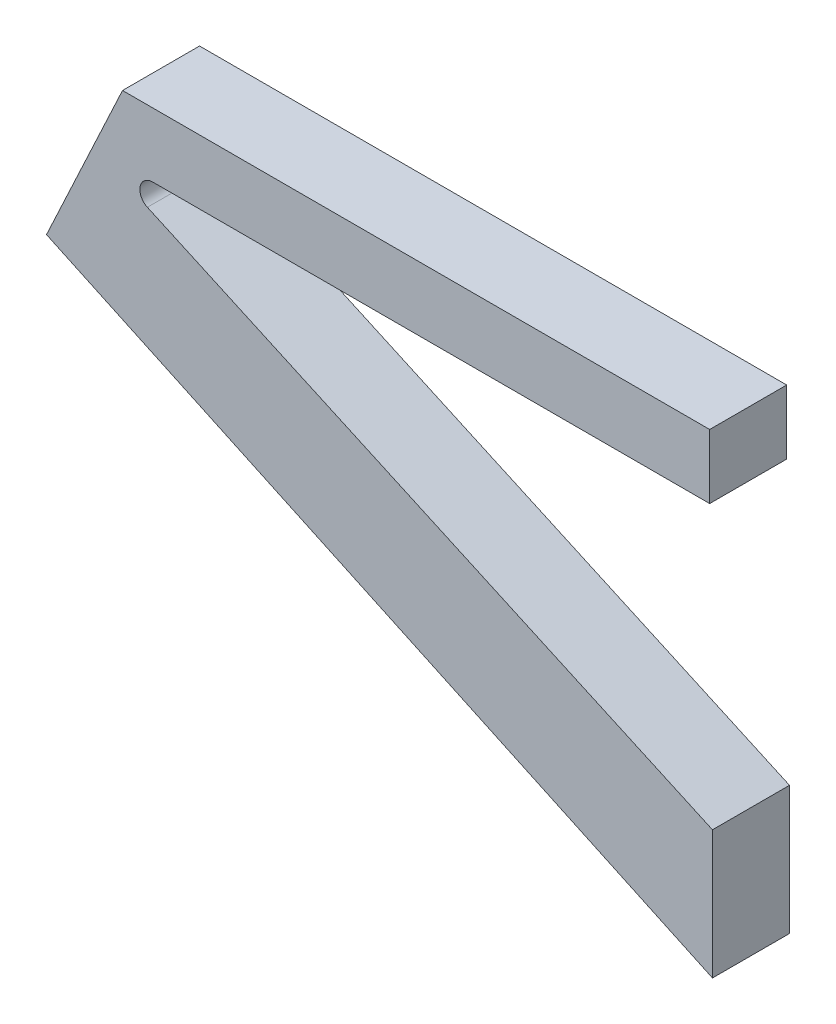
ISO-10303-21;
HEADER;
FILE_DESCRIPTION(('STEP AP214'),'2;1');
FILE_NAME('part.step','',(''),(''),'','','');
FILE_SCHEMA(('AUTOMOTIVE_DESIGN { 1 0 10303 214 1 1 1 1 }'));
ENDSEC;
DATA;
#1=APPLICATION_CONTEXT('core data for automotive mechanical design processes');
#2=APPLICATION_PROTOCOL_DEFINITION('international standard','automotive_design',2000,#1);
#3=PRODUCT_CONTEXT('',#1,'mechanical');
#4=PRODUCT('Part','Part','',(#3));
#5=PRODUCT_RELATED_PRODUCT_CATEGORY('part','',(#4));
#6=PRODUCT_DEFINITION_FORMATION('','',#4);
#7=PRODUCT_DEFINITION_CONTEXT('part definition',#1,'design');
#8=PRODUCT_DEFINITION('design','',#6,#7);
#9=PRODUCT_DEFINITION_SHAPE('','',#8);
#10=(LENGTH_UNIT() NAMED_UNIT(*) SI_UNIT(.MILLI.,.METRE.));
#11=(NAMED_UNIT(*) PLANE_ANGLE_UNIT() SI_UNIT($,.RADIAN.));
#12=(NAMED_UNIT(*) SI_UNIT($,.STERADIAN.) SOLID_ANGLE_UNIT());
#13=UNCERTAINTY_MEASURE_WITH_UNIT(LENGTH_MEASURE(1.E-05),#10,'distance_accuracy_value','');
#14=(GEOMETRIC_REPRESENTATION_CONTEXT(3) GLOBAL_UNCERTAINTY_ASSIGNED_CONTEXT((#13)) GLOBAL_UNIT_ASSIGNED_CONTEXT((#10,
#11,#12)) REPRESENTATION_CONTEXT('',''));
#15=CARTESIAN_POINT('',(0.,0.,0.));
#16=DIRECTION('',(0.,0.,1.));
#17=DIRECTION('',(1.,0.,0.));
#18=AXIS2_PLACEMENT_3D('',#15,#16,#17);
#19=CARTESIAN_POINT('',(0.,0.,-3.));
#20=DIRECTION('',(-1.,0.,0.));
#21=DIRECTION('',(0.,0.,1.));
#22=AXIS2_PLACEMENT_3D('',#19,#20,#21);
#23=PLANE('',#22);
#24=DIRECTION('',(0.,0.,1.));
#25=VECTOR('',#24,1.);
#26=CARTESIAN_POINT('',(0.,0.,-3.));
#27=LINE('',#26,#25);
#28=CARTESIAN_POINT('',(0.,0.,-3.));
#29=VERTEX_POINT('',#28);
#30=CARTESIAN_POINT('',(0.,0.,3.));
#31=VERTEX_POINT('',#30);
#32=EDGE_CURVE('E122',#29,#31,#27,.T.);
#33=ORIENTED_EDGE('',*,*,#32,.T.);
#34=DIRECTION('',(0.,-1.,0.));
#35=VECTOR('',#34,1.);
#36=CARTESIAN_POINT('',(0.,0.,3.));
#37=LINE('',#36,#35);
#38=CARTESIAN_POINT('',(0.,-5.,3.));
#39=VERTEX_POINT('',#38);
#40=EDGE_CURVE('E119',#31,#39,#37,.T.);
#41=ORIENTED_EDGE('',*,*,#40,.T.);
#42=DIRECTION('',(0.,0.,1.));
#43=VECTOR('',#42,1.);
#44=CARTESIAN_POINT('',(0.,-5.,-3.));
#45=LINE('',#44,#43);
#46=CARTESIAN_POINT('',(0.,-5.,-3.));
#47=VERTEX_POINT('',#46);
#48=EDGE_CURVE('E105',#47,#39,#45,.T.);
#49=ORIENTED_EDGE('',*,*,#48,.F.);
#50=DIRECTION('',(0.,-1.,0.));
#51=VECTOR('',#50,1.);
#52=CARTESIAN_POINT('',(0.,0.,-3.));
#53=LINE('',#52,#51);
#54=EDGE_CURVE('E138',#29,#47,#53,.T.);
#55=ORIENTED_EDGE('',*,*,#54,.F.);
#56=EDGE_LOOP('',(#33,#41,#49,#55));
#57=FACE_BOUND('',#56,.T.);
#58=ADVANCED_FACE('F43',(#57),#23,.F.);
#59=CARTESIAN_POINT('',(0.,-5.,-3.));
#60=DIRECTION('',(0.,1.,0.));
#61=DIRECTION('',(-1.,0.,0.));
#62=AXIS2_PLACEMENT_3D('',#59,#60,#61);
#63=PLANE('',#62);
#64=DIRECTION('',(-1.,0.,0.));
#65=VECTOR('',#64,1.);
#66=CARTESIAN_POINT('',(0.,-5.,3.));
#67=LINE('',#66,#65);
#68=CARTESIAN_POINT('',(-43.3887218637579,-5.,3.));
#69=VERTEX_POINT('',#68);
#70=EDGE_CURVE('E107',#39,#69,#67,.T.);
#71=ORIENTED_EDGE('',*,*,#70,.T.);
#72=DIRECTION('',(0.,0.,1.));
#73=VECTOR('',#72,1.);
#74=CARTESIAN_POINT('',(-43.3887218637579,-5.,-3.));
#75=LINE('',#74,#73);
#76=CARTESIAN_POINT('',(-43.3887218637579,-5.,-3.));
#77=VERTEX_POINT('',#76);
#78=EDGE_CURVE('E58',#69,#77,#75,.F.);
#79=ORIENTED_EDGE('',*,*,#78,.T.);
#80=DIRECTION('',(-1.,0.,0.));
#81=VECTOR('',#80,1.);
#82=CARTESIAN_POINT('',(0.,-5.,-3.));
#83=LINE('',#82,#81);
#84=EDGE_CURVE('E108',#47,#77,#83,.T.);
#85=ORIENTED_EDGE('',*,*,#84,.F.);
#86=ORIENTED_EDGE('',*,*,#48,.T.);
#87=EDGE_LOOP('',(#71,#79,#85,#86));
#88=FACE_BOUND('',#87,.T.);
#89=ADVANCED_FACE('F106',(#88),#63,.F.);
#90=CARTESIAN_POINT('',(-48.01,-5.,-3.));
#91=DIRECTION('',(-0.413422293216823,-0.910539404677987,0.));
#92=DIRECTION('',(0.910539404677987,-0.413422293216823,0.));
#93=AXIS2_PLACEMENT_3D('',#90,#91,#92);
#94=PLANE('',#93);
#95=DIRECTION('',(0.910539404677987,-0.413422293216823,0.));
#96=VECTOR('',#95,1.);
#97=CARTESIAN_POINT('',(-48.01,-5.,-3.));
#98=LINE('',#97,#96);
#99=CARTESIAN_POINT('',(-43.8021441569747,-6.91053940467799,-3.));
#100=VERTEX_POINT('',#99);
#101=CARTESIAN_POINT('',(0.217510674102606,-26.8972709545476,-3.));
#102=VERTEX_POINT('',#101);
#103=EDGE_CURVE('E141',#100,#102,#98,.T.);
#104=ORIENTED_EDGE('',*,*,#103,.F.);
#105=DIRECTION('',(0.,0.,1.));
#106=VECTOR('',#105,1.);
#107=CARTESIAN_POINT('',(-43.8021441569747,-6.91053940467799,3.));
#108=LINE('',#107,#106);
#109=CARTESIAN_POINT('',(-43.8021441569747,-6.91053940467799,3.));
#110=VERTEX_POINT('',#109);
#111=EDGE_CURVE('E113',#100,#110,#108,.T.);
#112=ORIENTED_EDGE('',*,*,#111,.T.);
#113=DIRECTION('',(0.910539404677987,-0.413422293216823,0.));
#114=VECTOR('',#113,1.);
#115=CARTESIAN_POINT('',(-48.01,-5.,3.));
#116=LINE('',#115,#114);
#117=CARTESIAN_POINT('',(0.217510674102606,-26.8972709545476,3.));
#118=VERTEX_POINT('',#117);
#119=EDGE_CURVE('E120',#110,#118,#116,.T.);
#120=ORIENTED_EDGE('',*,*,#119,.T.);
#121=DIRECTION('',(0.,0.,1.));
#122=VECTOR('',#121,1.);
#123=CARTESIAN_POINT('',(0.217510674102606,-26.8972709545476,-3.));
#124=LINE('',#123,#122);
#125=EDGE_CURVE('E114',#102,#118,#124,.T.);
#126=ORIENTED_EDGE('',*,*,#125,.F.);
#127=EDGE_LOOP('',(#104,#112,#120,#126));
#128=FACE_BOUND('',#127,.T.);
#129=ADVANCED_FACE('F169',(#128),#94,.F.);
#130=CARTESIAN_POINT('',(0.217510674102606,-36.8972709545476,-3.));
#131=DIRECTION('',(1.,0.,0.));
#132=DIRECTION('',(0.,0.,-1.));
#133=AXIS2_PLACEMENT_3D('',#130,#131,#132);
#134=PLANE('',#133);
#135=ORIENTED_EDGE('',*,*,#125,.T.);
#136=DIRECTION('',(0.,1.,0.));
#137=VECTOR('',#136,1.);
#138=CARTESIAN_POINT('',(0.217510674102606,-36.8972709545476,3.));
#139=LINE('',#138,#137);
#140=CARTESIAN_POINT('',(0.217510674102606,-36.8972709545476,3.));
#141=VERTEX_POINT('',#140);
#142=EDGE_CURVE('E127',#141,#118,#139,.T.);
#143=ORIENTED_EDGE('',*,*,#142,.F.);
#144=DIRECTION('',(0.,0.,1.));
#145=VECTOR('',#144,1.);
#146=CARTESIAN_POINT('',(0.217510674102606,-36.8972709545476,-3.));
#147=LINE('',#146,#145);
#148=CARTESIAN_POINT('',(0.217510674102606,-36.8972709545476,-3.));
#149=VERTEX_POINT('',#148);
#150=EDGE_CURVE('E160',#149,#141,#147,.T.);
#151=ORIENTED_EDGE('',*,*,#150,.F.);
#152=DIRECTION('',(0.,1.,0.));
#153=VECTOR('',#152,1.);
#154=CARTESIAN_POINT('',(0.217510674102606,-36.8972709545476,-3.));
#155=LINE('',#154,#153);
#156=EDGE_CURVE('E143',#149,#102,#155,.T.);
#157=ORIENTED_EDGE('',*,*,#156,.T.);
#158=EDGE_LOOP('',(#135,#143,#151,#157));
#159=FACE_BOUND('',#158,.T.);
#160=ADVANCED_FACE('F176',(#159),#134,.T.);
#161=CARTESIAN_POINT('',(-51.6610843591942,-12.6862429430981,-3.));
#162=DIRECTION('',(-0.422900052601738,-0.906176332459333,0.));
#163=DIRECTION('',(0.906176332459333,-0.422900052601738,0.));
#164=AXIS2_PLACEMENT_3D('',#161,#162,#163);
#165=PLANE('',#164);
#166=ORIENTED_EDGE('',*,*,#150,.T.);
#167=DIRECTION('',(0.906176332459333,-0.422900052601738,0.));
#168=VECTOR('',#167,1.);
#169=CARTESIAN_POINT('',(-51.6610843591942,-12.6862429430981,3.));
#170=LINE('',#169,#168);
#171=CARTESIAN_POINT('',(-51.6610843591942,-12.6862429430981,3.));
#172=VERTEX_POINT('',#171);
#173=EDGE_CURVE('E130',#172,#141,#170,.T.);
#174=ORIENTED_EDGE('',*,*,#173,.F.);
#175=DIRECTION('',(0.,0.,1.));
#176=VECTOR('',#175,1.);
#177=CARTESIAN_POINT('',(-51.6610843591942,-12.6862429430981,-3.));
#178=LINE('',#177,#176);
#179=CARTESIAN_POINT('',(-51.6610843591942,-12.6862429430981,-3.));
#180=VERTEX_POINT('',#179);
#181=EDGE_CURVE('E158',#180,#172,#178,.T.);
#182=ORIENTED_EDGE('',*,*,#181,.F.);
#183=DIRECTION('',(0.906176332459333,-0.422900052601738,0.));
#184=VECTOR('',#183,1.);
#185=CARTESIAN_POINT('',(-51.6610843591942,-12.6862429430981,-3.));
#186=LINE('',#185,#184);
#187=EDGE_CURVE('E146',#180,#149,#186,.T.);
#188=ORIENTED_EDGE('',*,*,#187,.T.);
#189=EDGE_LOOP('',(#166,#174,#182,#188));
#190=FACE_BOUND('',#189,.T.);
#191=ADVANCED_FACE('F183',(#190),#165,.T.);
#192=CARTESIAN_POINT('',(-45.74,0.,-3.));
#193=DIRECTION('',(-0.906160210221291,0.422934597085301,0.));
#194=DIRECTION('',(-0.422934597085301,-0.906160210221291,0.));
#195=AXIS2_PLACEMENT_3D('',#192,#193,#194);
#196=PLANE('',#195);
#197=ORIENTED_EDGE('',*,*,#181,.T.);
#198=DIRECTION('',(-0.422934597085301,-0.906160210221291,0.));
#199=VECTOR('',#198,1.);
#200=CARTESIAN_POINT('',(-45.74,0.,3.));
#201=LINE('',#200,#199);
#202=CARTESIAN_POINT('',(-45.74,0.,3.));
#203=VERTEX_POINT('',#202);
#204=EDGE_CURVE('E133',#203,#172,#201,.T.);
#205=ORIENTED_EDGE('',*,*,#204,.F.);
#206=DIRECTION('',(0.,0.,1.));
#207=VECTOR('',#206,1.);
#208=CARTESIAN_POINT('',(-45.74,0.,-3.));
#209=LINE('',#208,#207);
#210=CARTESIAN_POINT('',(-45.74,0.,-3.));
#211=VERTEX_POINT('',#210);
#212=EDGE_CURVE('E156',#211,#203,#209,.T.);
#213=ORIENTED_EDGE('',*,*,#212,.F.);
#214=DIRECTION('',(-0.422934597085301,-0.906160210221291,0.));
#215=VECTOR('',#214,1.);
#216=CARTESIAN_POINT('',(-45.74,0.,-3.));
#217=LINE('',#216,#215);
#218=EDGE_CURVE('E149',#211,#180,#217,.T.);
#219=ORIENTED_EDGE('',*,*,#218,.T.);
#220=EDGE_LOOP('',(#197,#205,#213,#219));
#221=FACE_BOUND('',#220,.T.);
#222=ADVANCED_FACE('F186',(#221),#196,.T.);
#223=CARTESIAN_POINT('',(0.,0.,-3.));
#224=DIRECTION('',(0.,1.,0.));
#225=DIRECTION('',(-1.,0.,0.));
#226=AXIS2_PLACEMENT_3D('',#223,#224,#225);
#227=PLANE('',#226);
#228=ORIENTED_EDGE('',*,*,#212,.T.);
#229=DIRECTION('',(-1.,0.,0.));
#230=VECTOR('',#229,1.);
#231=CARTESIAN_POINT('',(0.,0.,3.));
#232=LINE('',#231,#230);
#233=EDGE_CURVE('E136',#31,#203,#232,.T.);
#234=ORIENTED_EDGE('',*,*,#233,.F.);
#235=ORIENTED_EDGE('',*,*,#32,.F.);
#236=DIRECTION('',(-1.,0.,0.));
#237=VECTOR('',#236,1.);
#238=CARTESIAN_POINT('',(0.,0.,-3.));
#239=LINE('',#238,#237);
#240=EDGE_CURVE('E152',#29,#211,#239,.T.);
#241=ORIENTED_EDGE('',*,*,#240,.T.);
#242=EDGE_LOOP('',(#228,#234,#235,#241));
#243=FACE_BOUND('',#242,.T.);
#244=ADVANCED_FACE('F188',(#243),#227,.T.);
#245=CARTESIAN_POINT('',(0.,0.,-3.));
#246=DIRECTION('',(0.,0.,-1.));
#247=DIRECTION('',(-1.,0.,0.));
#248=AXIS2_PLACEMENT_3D('',#245,#246,#247);
#249=PLANE('',#248);
#250=ORIENTED_EDGE('',*,*,#54,.T.);
#251=ORIENTED_EDGE('',*,*,#84,.T.);
#252=CARTESIAN_POINT('',(-43.3887218637579,-6.,-3.));
#253=DIRECTION('',(0.,0.,-1.));
#254=DIRECTION('',(-1.,0.,0.));
#255=AXIS2_PLACEMENT_3D('',#252,#253,#254);
#256=CIRCLE('',#255,1.);
#257=EDGE_CURVE('E11',#77,#100,#256,.F.);
#258=ORIENTED_EDGE('',*,*,#257,.T.);
#259=ORIENTED_EDGE('',*,*,#103,.T.);
#260=ORIENTED_EDGE('',*,*,#156,.F.);
#261=ORIENTED_EDGE('',*,*,#187,.F.);
#262=ORIENTED_EDGE('',*,*,#218,.F.);
#263=ORIENTED_EDGE('',*,*,#240,.F.);
#264=EDGE_LOOP('',(#250,#251,#258,#259,#260,#261,#262,#263));
#265=FACE_BOUND('',#264,.T.);
#266=ADVANCED_FACE('F180',(#265),#249,.T.);
#267=CARTESIAN_POINT('',(0.,0.,3.));
#268=DIRECTION('',(0.,0.,-1.));
#269=DIRECTION('',(-1.,0.,0.));
#270=AXIS2_PLACEMENT_3D('',#267,#268,#269);
#271=PLANE('',#270);
#272=ORIENTED_EDGE('',*,*,#40,.F.);
#273=ORIENTED_EDGE('',*,*,#233,.T.);
#274=ORIENTED_EDGE('',*,*,#204,.T.);
#275=ORIENTED_EDGE('',*,*,#173,.T.);
#276=ORIENTED_EDGE('',*,*,#142,.T.);
#277=ORIENTED_EDGE('',*,*,#119,.F.);
#278=CARTESIAN_POINT('',(-43.3887218637579,-6.,3.));
#279=DIRECTION('',(0.,0.,-1.));
#280=DIRECTION('',(-1.,0.,0.));
#281=AXIS2_PLACEMENT_3D('',#278,#279,#280);
#282=CIRCLE('',#281,1.);
#283=EDGE_CURVE('E51',#110,#69,#282,.T.);
#284=ORIENTED_EDGE('',*,*,#283,.T.);
#285=ORIENTED_EDGE('',*,*,#70,.F.);
#286=EDGE_LOOP('',(#272,#273,#274,#275,#276,#277,#284,#285));
#287=FACE_BOUND('',#286,.T.);
#288=ADVANCED_FACE('F117',(#287),#271,.F.);
#289=CARTESIAN_POINT('',(-43.3887218637579,-6.,-3.));
#290=DIRECTION('',(0.,0.,-1.));
#291=DIRECTION('',(-1.,0.,0.));
#292=AXIS2_PLACEMENT_3D('',#289,#290,#291);
#293=CYLINDRICAL_SURFACE('',#292,1.);
#294=ORIENTED_EDGE('',*,*,#257,.F.);
#295=ORIENTED_EDGE('',*,*,#78,.F.);
#296=ORIENTED_EDGE('',*,*,#283,.F.);
#297=ORIENTED_EDGE('',*,*,#111,.F.);
#298=EDGE_LOOP('',(#294,#295,#296,#297));
#299=FACE_BOUND('',#298,.T.);
#300=ADVANCED_FACE('F45',(#299),#293,.F.);
#301=CLOSED_SHELL('',(#58,#89,#129,#160,#191,#222,#244,#266,#288,#300));
#302=MANIFOLD_SOLID_BREP('B2',#301);
#303=ADVANCED_BREP_SHAPE_REPRESENTATION('',(#18,#302),#14);
#304=SHAPE_DEFINITION_REPRESENTATION(#9,#303);
ENDSEC;
END-ISO-10303-21;
